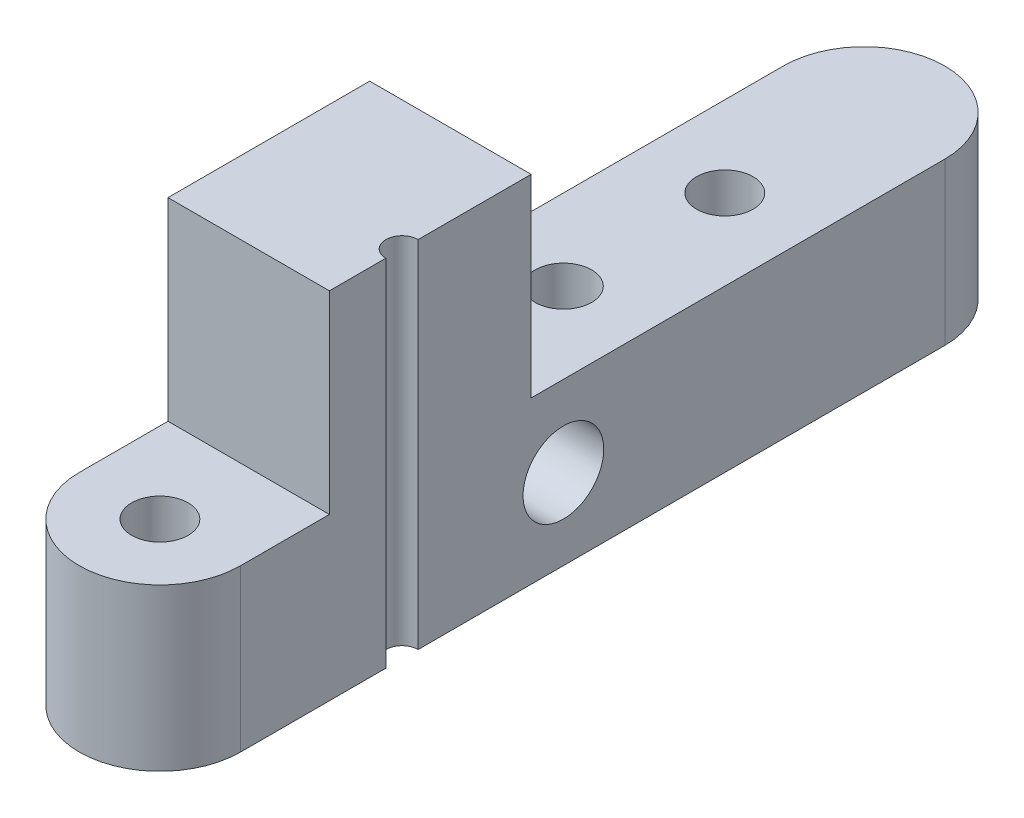
ISO-10303-21;
HEADER;
FILE_DESCRIPTION(('STEP AP214'),'2;1');
FILE_NAME('part.step','',(''),(''),'','','');
FILE_SCHEMA(('AUTOMOTIVE_DESIGN { 1 0 10303 214 1 1 1 1 }'));
ENDSEC;
DATA;
#1=APPLICATION_CONTEXT('core data for automotive mechanical design processes');
#2=APPLICATION_PROTOCOL_DEFINITION('international standard','automotive_design',2000,#1);
#3=PRODUCT_CONTEXT('',#1,'mechanical');
#4=PRODUCT('Part','Part','',(#3));
#5=PRODUCT_RELATED_PRODUCT_CATEGORY('part','',(#4));
#6=PRODUCT_DEFINITION_FORMATION('','',#4);
#7=PRODUCT_DEFINITION_CONTEXT('part definition',#1,'design');
#8=PRODUCT_DEFINITION('design','',#6,#7);
#9=PRODUCT_DEFINITION_SHAPE('','',#8);
#10=(LENGTH_UNIT() NAMED_UNIT(*) SI_UNIT(.MILLI.,.METRE.));
#11=(NAMED_UNIT(*) PLANE_ANGLE_UNIT() SI_UNIT($,.RADIAN.));
#12=(NAMED_UNIT(*) SI_UNIT($,.STERADIAN.) SOLID_ANGLE_UNIT());
#13=UNCERTAINTY_MEASURE_WITH_UNIT(LENGTH_MEASURE(1.E-05),#10,'distance_accuracy_value','');
#14=(GEOMETRIC_REPRESENTATION_CONTEXT(3) GLOBAL_UNCERTAINTY_ASSIGNED_CONTEXT((#13)) GLOBAL_UNIT_ASSIGNED_CONTEXT((#10,
#11,#12)) REPRESENTATION_CONTEXT('',''));
#15=CARTESIAN_POINT('',(0.,0.,0.));
#16=DIRECTION('',(0.,0.,1.));
#17=DIRECTION('',(1.,0.,0.));
#18=AXIS2_PLACEMENT_3D('',#15,#16,#17);
#19=CARTESIAN_POINT('',(0.,10.,-43.6303434416005));
#20=DIRECTION('',(0.,-1.,0.));
#21=DIRECTION('',(0.,0.,-1.));
#22=AXIS2_PLACEMENT_3D('',#19,#20,#21);
#23=CYLINDRICAL_SURFACE('',#22,5.);
#24=CARTESIAN_POINT('',(0.,0.,-43.6303434416005));
#25=DIRECTION('',(0.,1.,0.));
#26=DIRECTION('',(0.,0.,1.));
#27=AXIS2_PLACEMENT_3D('',#24,#25,#26);
#28=CIRCLE('',#27,5.);
#29=CARTESIAN_POINT('',(5.,0.,-43.6303434416005));
#30=VERTEX_POINT('',#29);
#31=CARTESIAN_POINT('',(-5.,0.,-43.6303434416005));
#32=VERTEX_POINT('',#31);
#33=EDGE_CURVE('E253',#30,#32,#28,.T.);
#34=ORIENTED_EDGE('',*,*,#33,.T.);
#35=DIRECTION('',(0.,-1.,0.));
#36=VECTOR('',#35,1.);
#37=CARTESIAN_POINT('',(-5.,10.,-43.6303434416005));
#38=LINE('',#37,#36);
#39=CARTESIAN_POINT('',(-5.,10.,-43.6303434416005));
#40=VERTEX_POINT('',#39);
#41=EDGE_CURVE('E261',#40,#32,#38,.T.);
#42=ORIENTED_EDGE('',*,*,#41,.F.);
#43=CARTESIAN_POINT('',(0.,10.,-43.6303434416005));
#44=DIRECTION('',(0.,1.,0.));
#45=DIRECTION('',(0.,0.,1.));
#46=AXIS2_PLACEMENT_3D('',#43,#44,#45);
#47=CIRCLE('',#46,5.);
#48=CARTESIAN_POINT('',(5.,10.,-43.6303434416005));
#49=VERTEX_POINT('',#48);
#50=EDGE_CURVE('E234',#49,#40,#47,.T.);
#51=ORIENTED_EDGE('',*,*,#50,.F.);
#52=DIRECTION('',(0.,-1.,0.));
#53=VECTOR('',#52,1.);
#54=CARTESIAN_POINT('',(5.,10.,-43.6303434416005));
#55=LINE('',#54,#53);
#56=EDGE_CURVE('E265',#49,#30,#55,.T.);
#57=ORIENTED_EDGE('',*,*,#56,.T.);
#58=EDGE_LOOP('',(#34,#42,#51,#57));
#59=FACE_BOUND('',#58,.T.);
#60=CARTESIAN_POINT('',(-2.,5.,-48.2129191365563));
#61=CARTESIAN_POINT('',(-1.99999540068022,5.10712368971296,-48.2129236693978));
#62=CARTESIAN_POINT('',(-1.99134173553407,5.21442629433185,-48.2167277795717));
#63=CARTESIAN_POINT('',(-1.95706710874823,5.42593908409957,-48.2314542746665));
#64=CARTESIAN_POINT('',(-1.93140279032341,5.53014065433852,-48.2423948478839));
#65=CARTESIAN_POINT('',(-1.86423554476216,5.73205180897083,-48.2699475487927));
#66=CARTESIAN_POINT('',(-1.82279228998551,5.82978424329122,-48.2865382842093));
#67=CARTESIAN_POINT('',(-1.72542013194152,6.0168853548623,-48.3234902134892));
#68=CARTESIAN_POINT('',(-1.66949439157707,6.10625585252411,-48.3438505838066));
#69=CARTESIAN_POINT('',(-1.54132201423254,6.27926031454434,-48.3873520572238));
#70=CARTESIAN_POINT('',(-1.46837936836551,6.36235639939725,-48.4105826118265));
#71=CARTESIAN_POINT('',(-1.30970909513215,6.5155290208558,-48.4564680207532));
#72=CARTESIAN_POINT('',(-1.22397701877347,6.58560100770971,-48.4791226715181));
#73=CARTESIAN_POINT('',(-1.03800631337303,6.71340639030971,-48.5223775180144));
#74=CARTESIAN_POINT('',(-0.937328966419092,6.77054429968594,-48.5428614777262));
#75=CARTESIAN_POINT('',(-0.726825322068637,6.86684357017379,-48.5783827186256));
#76=CARTESIAN_POINT('',(-0.617002769076881,6.90601224624887,-48.593422215633));
#77=CARTESIAN_POINT('',(-0.396966427039752,6.96334148599309,-48.6157266915066));
#78=CARTESIAN_POINT('',(-0.287028984858315,6.98242731397022,-48.6233328093068));
#79=CARTESIAN_POINT('',(-0.065266328583961,7.00202848578145,-48.6311465484748));
#80=CARTESIAN_POINT('',(0.0465581658394119,7.0025507559658,-48.631356929306));
#81=CARTESIAN_POINT('',(0.262232494702089,6.9855172301958,-48.6245630698066));
#82=CARTESIAN_POINT('',(0.366177452870457,6.96897522724529,-48.6179634093153));
#83=CARTESIAN_POINT('',(0.569673109221914,6.92000712369703,-48.5988363562919));
#84=CARTESIAN_POINT('',(0.669223484391239,6.88757985760154,-48.5863085288139));
#85=CARTESIAN_POINT('',(0.862897938510559,6.80736351712174,-48.5563116861751));
#86=CARTESIAN_POINT('',(0.956917623378897,6.75935028518462,-48.5387710462627));
#87=CARTESIAN_POINT('',(1.13580815074131,6.64953499308084,-48.5004892934032));
#88=CARTESIAN_POINT('',(1.22067584271796,6.58772820689983,-48.479747084272));
#89=CARTESIAN_POINT('',(1.38476882799018,6.44735086405612,-48.4355598133617));
#90=CARTESIAN_POINT('',(1.46325784526632,6.3679461074272,-48.4120267067181));
#91=CARTESIAN_POINT('',(1.60610741539265,6.197009428168,-48.3659600513331));
#92=CARTESIAN_POINT('',(1.67046334378698,6.1054735518044,-48.3434268316812));
#93=CARTESIAN_POINT('',(1.78490418871927,5.90958097762606,-48.3013124156907));
#94=CARTESIAN_POINT('',(1.83453465163626,5.80493516966135,-48.2818325821776));
#95=CARTESIAN_POINT('',(1.91517625986646,5.58778450968778,-48.2492193450413));
#96=CARTESIAN_POINT('',(1.94619949837798,5.47528481527341,-48.2360818205136));
#97=CARTESIAN_POINT('',(1.9869549488549,5.25296422253256,-48.2186410386276));
#98=CARTESIAN_POINT('',(1.99787209681454,5.14339955287144,-48.2138471061619));
#99=CARTESIAN_POINT('',(2.00156132644289,4.92392279224044,-48.2122384202909));
#100=CARTESIAN_POINT('',(1.99433891059128,4.81401081672435,-48.2154212472041));
#101=CARTESIAN_POINT('',(1.96303289479003,4.60354106504306,-48.2289038851916));
#102=CARTESIAN_POINT('',(1.93993306202386,4.50280706259994,-48.2387880195835));
#103=CARTESIAN_POINT('',(1.87880418691087,4.30671159521455,-48.2640439518739));
#104=CARTESIAN_POINT('',(1.84077183430228,4.21135132689285,-48.2794169664865));
#105=CARTESIAN_POINT('',(1.74913563948157,4.02439764220434,-48.3146812602015));
#106=CARTESIAN_POINT('',(1.69496286826465,3.93311381130547,-48.3347304879923));
#107=CARTESIAN_POINT('',(1.57316522444182,3.76051701255841,-48.3768472931784));
#108=CARTESIAN_POINT('',(1.50553487348189,3.67920812720455,-48.3989156905609));
#109=CARTESIAN_POINT('',(1.35284421168058,3.52262659140063,-48.4445526013146));
#110=CARTESIAN_POINT('',(1.26686542944543,3.4482434347084,-48.4681115144528));
#111=CARTESIAN_POINT('',(1.0830836333685,3.31482292339023,-48.5125413872758));
#112=CARTESIAN_POINT('',(0.985280138466607,3.25578619340488,-48.5334122375318));
#113=CARTESIAN_POINT('',(0.780279934003013,3.15495237353666,-48.5701806006044));
#114=CARTESIAN_POINT('',(0.673085480998742,3.11315115582634,-48.5860793040071));
#115=CARTESIAN_POINT('',(0.452393590914545,3.04845114760024,-48.6110705762895));
#116=CARTESIAN_POINT('',(0.338899610276817,3.02554209858931,-48.6201668386615));
#117=CARTESIAN_POINT('',(0.116816510362614,3.00049529834716,-48.6301335237191));
#118=CARTESIAN_POINT('',(0.00839049265208585,2.99709987143798,-48.6315019090979));
#119=CARTESIAN_POINT('',(-0.207433835792267,3.00785547938347,-48.6272038653377));
#120=CARTESIAN_POINT('',(-0.314832299614388,3.02200385815558,-48.6215385010882));
#121=CARTESIAN_POINT('',(-0.522170901733399,3.06654678799989,-48.6040585754188));
#122=CARTESIAN_POINT('',(-0.62223880386487,3.09642894475655,-48.5924382485904));
#123=CARTESIAN_POINT('',(-0.815922355542605,3.17105280588107,-48.5642929192741));
#124=CARTESIAN_POINT('',(-0.909536811189123,3.2157972509391,-48.5477670122291));
#125=CARTESIAN_POINT('',(-1.09220303880515,3.32110319335324,-48.5105243877192));
#126=CARTESIAN_POINT('',(-1.18087037518738,3.38227627532514,-48.4896547484725));
#127=CARTESIAN_POINT('',(-1.34705404014793,3.517788538747,-48.4462374638713));
#128=CARTESIAN_POINT('',(-1.42456572919735,3.59213316960822,-48.423689126243));
#129=CARTESIAN_POINT('',(-1.57120121894449,3.75731514684866,-48.3777211152773));
#130=CARTESIAN_POINT('',(-1.63950871002775,3.8488885751441,-48.3543339138814));
#131=CARTESIAN_POINT('',(-1.7598476276315,4.04294243572083,-48.310840010108));
#132=CARTESIAN_POINT('',(-1.81187714055767,4.14542414845355,-48.290733693555));
#133=CARTESIAN_POINT('',(-1.89399048451634,4.3490361864702,-48.2579325839911));
#134=CARTESIAN_POINT('',(-1.92562535665267,4.44946160271245,-48.2447344084046));
#135=CARTESIAN_POINT('',(-1.97271990928489,4.65448904149265,-48.2248017019417));
#136=CARTESIAN_POINT('',(-1.98822466191608,4.75907857342436,-48.2180491645048));
#137=CARTESIAN_POINT('',(-1.99692202185513,4.88677823911152,-48.2142610810214));
#138=CARTESIAN_POINT('',(-1.99807530751895,4.90940148035644,-48.2137587527733));
#139=CARTESIAN_POINT('',(-1.9996148112425,4.95468047679723,-48.2130872888277));
#140=CARTESIAN_POINT('',(-2.0000009730612,4.97733623425516,-48.2129181775597));
#141=CARTESIAN_POINT('',(-2.,5.,-48.2129191365563));
#142=B_SPLINE_CURVE_WITH_KNOTS('',3,(#60,#61,#62,#63,#64,#65,#66,#67,#68,#69,#70,#71,#72,#73,
#74,#75,#76,#77,#78,#79,#80,#81,#82,#83,#84,#85,#86,#87,#88,#89,#90,#91,#92,#93,#94,#95,#96,#97,
#98,#99,#100,#101,#102,#103,#104,#105,#106,#107,#108,#109,#110,#111,#112,#113,#114,#115,#116,
#117,#118,#119,#120,#121,#122,#123,#124,#125,#126,#127,#128,#129,#130,#131,#132,#133,#134,#135,
#136,#137,#138,#139,#140,#141),.UNSPECIFIED.,.T.,.F.,(4,2,2,2,2,2,2,2,2,2,2,2,2,2,2,2,2,2,2,2,2,
2,2,2,2,2,2,2,2,2,2,2,2,2,2,2,2,2,2,2,4),(0.,0.321277648767654,0.643377335822246,
0.964270823293392,1.28509428823861,1.62255618284425,1.96013574348342,2.31102669091428,
2.6617746696948,2.99554182887184,3.32918445305672,3.64408644830302,3.9590115512906,
4.27868300234898,4.59846414940031,4.93924044081356,5.28012807127127,5.63064458717257,
5.98093304800101,6.30982147524421,6.63861014907939,6.94867248085145,7.25880358651638,
7.58151154652701,7.90435114525849,8.25103734246979,8.59773764852748,8.94435487312812,
9.29078375954136,9.61461039755953,9.93838801512601,10.2522199444335,10.5661097782858,
10.8938705113992,11.2217671656421,11.5699625328561,11.9181988175919,12.2351666081908,
12.5512463021924,12.619212852096,12.6871843847255),.UNSPECIFIED.);
#143=CARTESIAN_POINT('',(-2.,5.,-48.2129191365563));
#144=VERTEX_POINT('',#143);
#145=EDGE_CURVE('E156',#144,#144,#142,.T.);
#146=ORIENTED_EDGE('',*,*,#145,.F.);
#147=EDGE_LOOP('',(#146));
#148=FACE_BOUND('',#147,.T.);
#149=ADVANCED_FACE('F42',(#59,#148),#23,.T.);
#150=CARTESIAN_POINT('',(0.,10.,-35.));
#151=DIRECTION('',(0.,-1.,0.));
#152=DIRECTION('',(0.,0.,-1.));
#153=AXIS2_PLACEMENT_3D('',#150,#151,#152);
#154=CYLINDRICAL_SURFACE('',#153,1.75);
#155=CARTESIAN_POINT('',(0.,10.,-35.));
#156=DIRECTION('',(0.,1.,0.));
#157=DIRECTION('',(0.,0.,1.));
#158=AXIS2_PLACEMENT_3D('',#155,#156,#157);
#159=CIRCLE('',#158,1.75);
#160=CARTESIAN_POINT('',(0.,10.,-33.25));
#161=VERTEX_POINT('',#160);
#162=EDGE_CURVE('E199',#161,#161,#159,.T.);
#163=ORIENTED_EDGE('',*,*,#162,.T.);
#164=EDGE_LOOP('',(#163));
#165=FACE_BOUND('',#164,.T.);
#166=CARTESIAN_POINT('',(0.,7.,-36.75));
#167=CARTESIAN_POINT('',(0.0818245025296046,6.99999318807239,-36.749993072029));
#168=CARTESIAN_POINT('',(0.16372359512841,6.9949308008218,-36.7442135533212));
#169=CARTESIAN_POINT('',(0.32479959879475,6.97512526523961,-36.7215252080675));
#170=CARTESIAN_POINT('',(0.4039723393443,6.96036792343921,-36.7046000641759));
#171=CARTESIAN_POINT('',(0.556827744458604,6.92252576757605,-36.6609405189438));
#172=CARTESIAN_POINT('',(0.630542392306208,6.89949502453024,-36.6342697911012));
#173=CARTESIAN_POINT('',(0.771699152967102,6.84666549739607,-36.5725539730338));
#174=CARTESIAN_POINT('',(0.839139739912402,6.81686507293721,-36.537506853007));
#175=CARTESIAN_POINT('',(0.991939149824093,6.73952576758103,-36.445442773154));
#176=CARTESIAN_POINT('',(1.07412381439225,6.68958652903394,-36.3851736631628));
#177=CARTESIAN_POINT('',(1.22495692232278,6.58367300323497,-36.2538087152204));
#178=CARTESIAN_POINT('',(1.293568816051,6.52768303188458,-36.18268453335));
#179=CARTESIAN_POINT('',(1.41872832285009,6.4122907089768,-36.029429712569));
#180=CARTESIAN_POINT('',(1.47498118660361,6.35284063182168,-35.9470933854036));
#181=CARTESIAN_POINT('',(1.54876159980759,6.26601395290817,-35.8162889297382));
#182=CARTESIAN_POINT('',(1.57157877870542,6.23747844904598,-35.771497892861));
#183=CARTESIAN_POINT('',(1.61360006507098,6.18215700992636,-35.6792383807082));
#184=CARTESIAN_POINT('',(1.63280691970974,6.1553697546056,-35.6317719772186));
#185=CARTESIAN_POINT('',(1.6679059757124,6.10412026346216,-35.5324002022851));
#186=CARTESIAN_POINT('',(1.6836826451294,6.07975083656859,-35.4804048106428));
#187=CARTESIAN_POINT('',(1.71066366224867,6.03647531840207,-35.3730664466866));
#188=CARTESIAN_POINT('',(1.7218768347095,6.01755870351363,-35.3177301752522));
#189=CARTESIAN_POINT('',(1.73769244890359,5.99027229931864,-35.2127989544757));
#190=CARTESIAN_POINT('',(1.74304826902134,5.98072504549264,-35.1636367133779));
#191=CARTESIAN_POINT('',(1.7495292330162,5.96912171143739,-35.0641843148816));
#192=CARTESIAN_POINT('',(1.75066103412104,5.9670538435471,-35.0138960580958));
#193=CARTESIAN_POINT('',(1.74859035454347,5.97079024682573,-34.9137180366401));
#194=CARTESIAN_POINT('',(1.74538759627129,5.97659502216709,-34.8638282976975));
#195=CARTESIAN_POINT('',(1.7349535991965,5.99500969173099,-34.7657324999082));
#196=CARTESIAN_POINT('',(1.72771432062414,6.00763316557452,-34.7175300059265));
#197=CARTESIAN_POINT('',(1.70425068598187,6.04704832941551,-34.5951140111742));
#198=CARTESIAN_POINT('',(1.68524057634185,6.07779336733177,-34.5227450969236));
#199=CARTESIAN_POINT('',(1.63956408638123,6.14609377879976,-34.3837860164874));
#200=CARTESIAN_POINT('',(1.61286560320825,6.18367745974127,-34.3172216378795));
#201=CARTESIAN_POINT('',(1.55839915810281,6.25418412125038,-34.2018061289853));
#202=CARTESIAN_POINT('',(1.53186466199221,6.28657835656164,-34.1520390320228));
#203=CARTESIAN_POINT('',(1.47437664589163,6.35207910768318,-34.0556124511574));
#204=CARTESIAN_POINT('',(1.44342064991219,6.38518601369889,-34.0089547300851));
#205=CARTESIAN_POINT('',(1.34400399882334,6.48403137058757,-33.8736426927592));
#206=CARTESIAN_POINT('',(1.26889002770649,6.54943862941952,-33.7894291167708));
#207=CARTESIAN_POINT('',(1.11988697529646,6.65903240259667,-33.6523630149891));
#208=CARTESIAN_POINT('',(1.04959566301807,6.70466429544594,-33.5967320757009));
#209=CARTESIAN_POINT('',(0.89840847088353,6.78894129539817,-33.4954715091943));
#210=CARTESIAN_POINT('',(0.81753125576864,6.82759842134043,-33.4498246481393));
#211=CARTESIAN_POINT('',(0.662316651015108,6.88862952123534,-33.3783670980447));
#212=CARTESIAN_POINT('',(0.589627656721596,6.91269981880513,-33.3504384193783));
#213=CARTESIAN_POINT('',(0.439113409856922,6.95274864621724,-33.3041629744114));
#214=CARTESIAN_POINT('',(0.361291215855797,6.96873194626232,-33.2858105592481));
#215=CARTESIAN_POINT('',(0.202082178271771,6.99139564503222,-33.2598283504202));
#216=CARTESIAN_POINT('',(0.120678598477803,6.99802618705894,-33.2522560201308));
#217=CARTESIAN_POINT('',(-0.0425790890073998,7.00121129889969,-33.2486154499501));
#218=CARTESIAN_POINT('',(-0.124433093705261,6.9977680838081,-33.2525446810081));
#219=CARTESIAN_POINT('',(-0.278782450467959,6.98186303926608,-33.2707522449664));
#220=CARTESIAN_POINT('',(-0.35147537495584,6.97020607795172,-33.2841071339384));
#221=CARTESIAN_POINT('',(-0.493146367127909,6.93960390658484,-33.3193337078847));
#222=CARTESIAN_POINT('',(-0.562123399277813,6.92065667675653,-33.3412077531199));
#223=CARTESIAN_POINT('',(-0.699573919513984,6.875149186195,-33.3941110973632));
#224=CARTESIAN_POINT('',(-0.767706525066316,6.84816520789075,-33.425654009535));
#225=CARTESIAN_POINT('',(-0.897526478387716,6.78872894045103,-33.4958724972625));
#226=CARTESIAN_POINT('',(-0.959213128004971,6.75627605997946,-33.534548844178));
#227=CARTESIAN_POINT('',(-1.10589019947564,6.66959013654285,-33.6393738761598));
#228=CARTESIAN_POINT('',(-1.18655293424206,6.61273845463906,-33.709422614471));
#229=CARTESIAN_POINT('',(-1.33282098201672,6.49414988479084,-33.8610186241862));
#230=CARTESIAN_POINT('',(-1.39834481262217,6.43238886050845,-33.9426244726878));
#231=CARTESIAN_POINT('',(-1.48580806586674,6.3394956296202,-34.0738728722587));
#232=CARTESIAN_POINT('',(-1.51340989881686,6.30812846907569,-34.1196733108013));
#233=CARTESIAN_POINT('',(-1.56460012429878,6.24644670063917,-34.2142371635083));
#234=CARTESIAN_POINT('',(-1.58818505491237,6.21613301840203,-34.263003084816));
#235=CARTESIAN_POINT('',(-1.63100683537039,6.15806234978259,-34.3633871859932));
#236=CARTESIAN_POINT('',(-1.6502716335038,6.13028966107165,-34.4149841753529));
#237=CARTESIAN_POINT('',(-1.6842667223411,6.07897582010599,-34.5215996411521));
#238=CARTESIAN_POINT('',(-1.69900685517872,6.05542553033133,-34.5766103738261));
#239=CARTESIAN_POINT('',(-1.72166632701625,6.01797844917071,-34.6824030075579));
#240=CARTESIAN_POINT('',(-1.73024695125749,6.00319713450213,-34.7327179626824));
#241=CARTESIAN_POINT('',(-1.74300419255664,5.98087102223166,-34.8353948087621));
#242=CARTESIAN_POINT('',(-1.74719463253129,5.97330351807746,-34.8877497333588));
#243=CARTESIAN_POINT('',(-1.75079218827415,5.96682232014371,-34.9935563506398));
#244=CARTESIAN_POINT('',(-1.75016635622607,5.96796823367362,-35.047013098418));
#245=CARTESIAN_POINT('',(-1.74412392212424,5.97880741416597,-35.1528256010528));
#246=CARTESIAN_POINT('',(-1.73869685714475,5.98851934820137,-35.2051786955602));
#247=CARTESIAN_POINT('',(-1.72104163156517,6.01902365002623,-35.3244530073888));
#248=CARTESIAN_POINT('',(-1.70715214718598,6.04242648250763,-35.3904304463704));
#249=CARTESIAN_POINT('',(-1.67299050807307,6.09641329870773,-35.517664163978));
#250=CARTESIAN_POINT('',(-1.65269569213523,6.12702267901647,-35.578902704136));
#251=CARTESIAN_POINT('',(-1.60958732771959,6.18761264630082,-35.6890034409965));
#252=CARTESIAN_POINT('',(-1.58748827260427,6.21711587742678,-35.7384179680774));
#253=CARTESIAN_POINT('',(-1.53925261579027,6.27757677636152,-35.8343157735127));
#254=CARTESIAN_POINT('',(-1.51311341343735,6.30853537199703,-35.8807971364476));
#255=CARTESIAN_POINT('',(-1.42869249299731,6.40209506707072,-36.0162095158258));
#256=CARTESIAN_POINT('',(-1.36442624927279,6.46535183419495,-36.1010617083196));
#257=CARTESIAN_POINT('',(-1.21728244333041,6.58993793433008,-36.2621552150292));
#258=CARTESIAN_POINT('',(-1.13382589353645,6.65111945404143,-36.3379846605815));
#259=CARTESIAN_POINT('',(-0.949576468877474,6.76347207155778,-36.4743871782486));
#260=CARTESIAN_POINT('',(-0.848849012594657,6.81467944043135,-36.5350157685951));
#261=CARTESIAN_POINT('',(-0.671312599684847,6.88544043118102,-36.6179178268691));
#262=CARTESIAN_POINT('',(-0.599133494248597,6.90973235953479,-36.6461206586022));
#263=CARTESIAN_POINT('',(-0.449671220554028,6.95032059710904,-36.6930422326007));
#264=CARTESIAN_POINT('',(-0.372399149150777,6.96663367759527,-36.7117808710074));
#265=CARTESIAN_POINT('',(-0.245453641042335,6.9854803116908,-36.7333916296852));
#266=CARTESIAN_POINT('',(-0.196745232404745,6.99090585643359,-36.7396005919032));
#267=CARTESIAN_POINT('',(-0.0987003687088782,6.99816820874578,-36.7479073862178));
#268=CARTESIAN_POINT('',(-0.0493637581310841,7.00000410955565,-36.7500041795633));
#269=CARTESIAN_POINT('',(0.,7.,-36.75));
#270=B_SPLINE_CURVE_WITH_KNOTS('',3,(#166,#167,#168,#169,#170,#171,#172,#173,#174,#175,#176,
#177,#178,#179,#180,#181,#182,#183,#184,#185,#186,#187,#188,#189,#190,#191,#192,#193,#194,#195,
#196,#197,#198,#199,#200,#201,#202,#203,#204,#205,#206,#207,#208,#209,#210,#211,#212,#213,#214,
#215,#216,#217,#218,#219,#220,#221,#222,#223,#224,#225,#226,#227,#228,#229,#230,#231,#232,#233,
#234,#235,#236,#237,#238,#239,#240,#241,#242,#243,#244,#245,#246,#247,#248,#249,#250,#251,#252,
#253,#254,#255,#256,#257,#258,#259,#260,#261,#262,#263,#264,#265,#266,#267,#268,#269),
.UNSPECIFIED.,.T.,.F.,(4,2,2,2,2,2,2,2,2,2,2,2,2,2,2,2,2,2,2,2,2,2,2,2,2,2,2,2,2,2,2,2,2,2,2,2,
2,2,2,2,2,2,2,2,2,2,2,2,2,2,2,4),(0.,0.245259053498181,0.490877970207243,0.734920001920514,
0.979021230978333,1.31764662075108,1.65717182784,2.00407930528858,2.17733919594492,
2.35046671106962,2.5287417301278,2.70667034903457,2.85712699179176,3.00734640831139,
3.15757544549674,3.30810477688744,3.54941436749755,3.79174653192186,3.98661943987438,
4.18160190541843,4.57072620124056,4.87145691596163,5.17166435980182,5.41519000548517,
5.65857183698305,5.90324622192581,6.14786681004676,6.37135328895926,6.59490172964729,
6.83337063587927,7.07186534360804,7.43299661757768,7.79602854590602,7.98185325625892,
8.16783731575105,8.35258105256036,8.5369200362573,8.69577149786123,8.85412128331189,
9.01355528783699,9.17333759176682,9.38624528122281,9.59991481619513,9.78461648492753,
9.96943754564029,10.3392519055546,10.7221756552521,11.1036797791213,11.3463920984025,
11.5885920284107,11.7365165636284,11.884478460396),.UNSPECIFIED.);
#271=CARTESIAN_POINT('',(0.,7.,-36.75));
#272=VERTEX_POINT('',#271);
#273=EDGE_CURVE('E46',#272,#272,#270,.T.);
#274=ORIENTED_EDGE('',*,*,#273,.T.);
#275=EDGE_LOOP('',(#274));
#276=FACE_BOUND('',#275,.T.);
#277=ADVANCED_FACE('F277',(#165,#276),#154,.F.);
#278=CARTESIAN_POINT('',(0.,0.,-35.));
#279=DIRECTION('',(0.,1.,0.));
#280=DIRECTION('',(0.,0.,1.));
#281=AXIS2_PLACEMENT_3D('',#278,#279,#280);
#282=CIRCLE('',#281,1.75);
#283=CARTESIAN_POINT('',(0.,0.,-33.25));
#284=VERTEX_POINT('',#283);
#285=EDGE_CURVE('E195',#284,#284,#282,.T.);
#286=ORIENTED_EDGE('',*,*,#285,.F.);
#287=EDGE_LOOP('',(#286));
#288=FACE_BOUND('',#287,.T.);
#289=CARTESIAN_POINT('',(0.,3.,-36.75));
#290=CARTESIAN_POINT('',(-0.0818245025296039,3.00000681192761,-36.749993072029));
#291=CARTESIAN_POINT('',(-0.163723595128409,3.00506919917821,-36.7442135533212));
#292=CARTESIAN_POINT('',(-0.324799598794748,3.02487473476039,-36.7215252080675));
#293=CARTESIAN_POINT('',(-0.403972339344298,3.03963207656079,-36.7046000641759));
#294=CARTESIAN_POINT('',(-0.556827744458603,3.07747423242395,-36.6609405189438));
#295=CARTESIAN_POINT('',(-0.630542392306208,3.10050497546976,-36.6342697911012));
#296=CARTESIAN_POINT('',(-0.771699152967101,3.15333450260393,-36.5725539730338));
#297=CARTESIAN_POINT('',(-0.8391397399124,3.18313492706279,-36.537506853007));
#298=CARTESIAN_POINT('',(-0.991939149824091,3.26047423241897,-36.445442773154));
#299=CARTESIAN_POINT('',(-1.07412381439225,3.31041347096606,-36.3851736631628));
#300=CARTESIAN_POINT('',(-1.22495692232278,3.41632699676503,-36.2538087152204));
#301=CARTESIAN_POINT('',(-1.293568816051,3.47231696811542,-36.18268453335));
#302=CARTESIAN_POINT('',(-1.41872832285009,3.5877092910232,-36.029429712569));
#303=CARTESIAN_POINT('',(-1.47498118660361,3.64715936817832,-35.9470933854036));
#304=CARTESIAN_POINT('',(-1.54876159980759,3.73398604709183,-35.8162889297382));
#305=CARTESIAN_POINT('',(-1.57157877870542,3.76252155095402,-35.771497892861));
#306=CARTESIAN_POINT('',(-1.61360006507098,3.81784299007364,-35.6792383807082));
#307=CARTESIAN_POINT('',(-1.63280691970974,3.8446302453944,-35.6317719772186));
#308=CARTESIAN_POINT('',(-1.6679059757124,3.89587973653784,-35.5324002022851));
#309=CARTESIAN_POINT('',(-1.68368264512939,3.92024916343141,-35.4804048106428));
#310=CARTESIAN_POINT('',(-1.71066366224867,3.96352468159794,-35.3730664466865));
#311=CARTESIAN_POINT('',(-1.7218768347095,3.98244129648637,-35.3177301752522));
#312=CARTESIAN_POINT('',(-1.73769244890359,4.00972770068136,-35.2127989544757));
#313=CARTESIAN_POINT('',(-1.74304826902134,4.01927495450736,-35.1636367133779));
#314=CARTESIAN_POINT('',(-1.7495292330162,4.03087828856261,-35.0641843148816));
#315=CARTESIAN_POINT('',(-1.75066103412104,4.0329461564529,-35.0138960580958));
#316=CARTESIAN_POINT('',(-1.74859035454347,4.02920975317427,-34.9137180366401));
#317=CARTESIAN_POINT('',(-1.74538759627128,4.02340497783291,-34.8638282976974));
#318=CARTESIAN_POINT('',(-1.7349535991965,4.00499030826901,-34.7657324999082));
#319=CARTESIAN_POINT('',(-1.72771432062414,3.99236683442548,-34.7175300059265));
#320=CARTESIAN_POINT('',(-1.70425068598186,3.95295167058448,-34.5951140111742));
#321=CARTESIAN_POINT('',(-1.68524057634184,3.92220663266822,-34.5227450969236));
#322=CARTESIAN_POINT('',(-1.63956408638122,3.85390622120024,-34.3837860164874));
#323=CARTESIAN_POINT('',(-1.61286560320824,3.81632254025872,-34.3172216378794));
#324=CARTESIAN_POINT('',(-1.5583991581028,3.74581587874961,-34.2018061289853));
#325=CARTESIAN_POINT('',(-1.5318646619922,3.71342164343835,-34.1520390320228));
#326=CARTESIAN_POINT('',(-1.47437664589162,3.64792089231681,-34.0556124511574));
#327=CARTESIAN_POINT('',(-1.44342064991218,3.61481398630109,-34.0089547300851));
#328=CARTESIAN_POINT('',(-1.34400399882332,3.51596862941242,-33.8736426927592));
#329=CARTESIAN_POINT('',(-1.26889002770647,3.45056137058046,-33.7894291167708));
#330=CARTESIAN_POINT('',(-1.11988697529644,3.34096759740332,-33.6523630149891));
#331=CARTESIAN_POINT('',(-1.04959566301805,3.29533570455405,-33.5967320757009));
#332=CARTESIAN_POINT('',(-0.898408470883515,3.21105870460183,-33.4954715091943));
#333=CARTESIAN_POINT('',(-0.817531255768626,3.17240157865957,-33.4498246481393));
#334=CARTESIAN_POINT('',(-0.662316651015092,3.11137047876466,-33.3783670980447));
#335=CARTESIAN_POINT('',(-0.589627656721577,3.08730018119487,-33.3504384193783));
#336=CARTESIAN_POINT('',(-0.439113409856903,3.04725135378276,-33.3041629744114));
#337=CARTESIAN_POINT('',(-0.36129121585578,3.03126805373768,-33.2858105592481));
#338=CARTESIAN_POINT('',(-0.202082178271754,3.00860435496778,-33.2598283504202));
#339=CARTESIAN_POINT('',(-0.120678598477785,3.00197381294106,-33.2522560201308));
#340=CARTESIAN_POINT('',(0.0425790890074187,2.99878870110031,-33.2486154499501));
#341=CARTESIAN_POINT('',(0.12443309370528,3.0022319161919,-33.2525446810081));
#342=CARTESIAN_POINT('',(0.278782450467978,3.01813696073392,-33.2707522449664));
#343=CARTESIAN_POINT('',(0.35147537495586,3.02979392204828,-33.2841071339384));
#344=CARTESIAN_POINT('',(0.493146367127928,3.06039609341517,-33.3193337078848));
#345=CARTESIAN_POINT('',(0.562123399277831,3.07934332324347,-33.34120775312));
#346=CARTESIAN_POINT('',(0.699573919514001,3.12485081380501,-33.3941110973632));
#347=CARTESIAN_POINT('',(0.767706525066334,3.15183479210926,-33.425654009535));
#348=CARTESIAN_POINT('',(0.897526478387733,3.21127105954898,-33.4958724972625));
#349=CARTESIAN_POINT('',(0.959213128004987,3.24372394002055,-33.534548844178));
#350=CARTESIAN_POINT('',(1.10589019947565,3.33040986345716,-33.6393738761598));
#351=CARTESIAN_POINT('',(1.18655293424208,3.38726154536096,-33.709422614471));
#352=CARTESIAN_POINT('',(1.33282098201674,3.50585011520918,-33.8610186241862));
#353=CARTESIAN_POINT('',(1.39834481262218,3.56761113949156,-33.9426244726878));
#354=CARTESIAN_POINT('',(1.48580806586674,3.66050437037981,-34.0738728722587));
#355=CARTESIAN_POINT('',(1.51340989881687,3.69187153092432,-34.1196733108013));
#356=CARTESIAN_POINT('',(1.56460012429879,3.75355329936084,-34.2142371635083));
#357=CARTESIAN_POINT('',(1.58818505491238,3.78386698159798,-34.263003084816));
#358=CARTESIAN_POINT('',(1.6310068353704,3.84193765021742,-34.3633871859932));
#359=CARTESIAN_POINT('',(1.6502716335038,3.86971033892836,-34.414984175353));
#360=CARTESIAN_POINT('',(1.6842667223411,3.92102417989402,-34.5215996411522));
#361=CARTESIAN_POINT('',(1.69900685517872,3.94457446966868,-34.5766103738261));
#362=CARTESIAN_POINT('',(1.72166632701625,3.9820215508293,-34.6824030075579));
#363=CARTESIAN_POINT('',(1.73024695125749,3.99680286549788,-34.7327179626824));
#364=CARTESIAN_POINT('',(1.74300419255664,4.01912897776835,-34.8353948087621));
#365=CARTESIAN_POINT('',(1.74719463253129,4.02669648192255,-34.8877497333588));
#366=CARTESIAN_POINT('',(1.75079218827415,4.03317767985629,-34.9935563506398));
#367=CARTESIAN_POINT('',(1.75016635622607,4.03203176632639,-35.047013098418));
#368=CARTESIAN_POINT('',(1.74412392212424,4.02119258583403,-35.1528256010528));
#369=CARTESIAN_POINT('',(1.73869685714475,4.01148065179863,-35.2051786955603));
#370=CARTESIAN_POINT('',(1.72104163156516,3.98097634997376,-35.3244530073888));
#371=CARTESIAN_POINT('',(1.70715214718598,3.95757351749236,-35.3904304463704));
#372=CARTESIAN_POINT('',(1.67299050807306,3.90358670129227,-35.5176641639781));
#373=CARTESIAN_POINT('',(1.65269569213522,3.87297732098352,-35.578902704136));
#374=CARTESIAN_POINT('',(1.60958732771958,3.81238735369918,-35.6890034409966));
#375=CARTESIAN_POINT('',(1.58748827260426,3.78288412257321,-35.7384179680774));
#376=CARTESIAN_POINT('',(1.53925261579026,3.72242322363847,-35.8343157735127));
#377=CARTESIAN_POINT('',(1.51311341343734,3.69146462800295,-35.8807971364476));
#378=CARTESIAN_POINT('',(1.42869249299729,3.59790493292927,-36.0162095158258));
#379=CARTESIAN_POINT('',(1.36442624927277,3.53464816580504,-36.1010617083196));
#380=CARTESIAN_POINT('',(1.21728244333039,3.41006206566991,-36.2621552150292));
#381=CARTESIAN_POINT('',(1.13382589353643,3.34888054595855,-36.3379846605815));
#382=CARTESIAN_POINT('',(0.949576468877446,3.23652792844221,-36.4743871782486));
#383=CARTESIAN_POINT('',(0.848849012594625,3.18532055956864,-36.5350157685951));
#384=CARTESIAN_POINT('',(0.671312599684811,3.11455956881897,-36.6179178268691));
#385=CARTESIAN_POINT('',(0.59913349424856,3.0902676404652,-36.6461206586022));
#386=CARTESIAN_POINT('',(0.449671220553992,3.04967940289095,-36.6930422326007));
#387=CARTESIAN_POINT('',(0.372399149150742,3.03336632240472,-36.7117808710074));
#388=CARTESIAN_POINT('',(0.245453641042305,3.0145196883092,-36.7333916296852));
#389=CARTESIAN_POINT('',(0.196745232404722,3.00909414356641,-36.7396005919032));
#390=CARTESIAN_POINT('',(0.0987003687088669,3.00183179125422,-36.7479073862178));
#391=CARTESIAN_POINT('',(0.0493637581310789,2.99999589044435,-36.7500041795633));
#392=CARTESIAN_POINT('',(0.,3.,-36.75));
#393=B_SPLINE_CURVE_WITH_KNOTS('',3,(#289,#290,#291,#292,#293,#294,#295,#296,#297,#298,#299,
#300,#301,#302,#303,#304,#305,#306,#307,#308,#309,#310,#311,#312,#313,#314,#315,#316,#317,#318,
#319,#320,#321,#322,#323,#324,#325,#326,#327,#328,#329,#330,#331,#332,#333,#334,#335,#336,#337,
#338,#339,#340,#341,#342,#343,#344,#345,#346,#347,#348,#349,#350,#351,#352,#353,#354,#355,#356,
#357,#358,#359,#360,#361,#362,#363,#364,#365,#366,#367,#368,#369,#370,#371,#372,#373,#374,#375,
#376,#377,#378,#379,#380,#381,#382,#383,#384,#385,#386,#387,#388,#389,#390,#391,#392),
.UNSPECIFIED.,.T.,.F.,(4,2,2,2,2,2,2,2,2,2,2,2,2,2,2,2,2,2,2,2,2,2,2,2,2,2,2,2,2,2,2,2,2,2,2,2,
2,2,2,2,2,2,2,2,2,2,2,2,2,2,2,4),(0.,0.245259053498181,0.490877970207242,0.734920001920511,
0.979021230978334,1.31764662075108,1.65717182784,2.00407930528858,2.17733919594492,
2.35046671106962,2.5287417301278,2.70667034903457,2.85712699179176,3.00734640831139,
3.15757544549674,3.30810477688744,3.54941436749757,3.79174653192188,3.98661943987441,
4.18160190541846,4.57072620124059,4.87145691596165,5.17166435980184,5.41519000548519,
5.65857183698307,5.90324622192582,6.14786681004678,6.37135328895928,6.59490172964731,
6.8333706358793,7.07186534360806,7.4329966175777,7.79602854590604,7.98185325625894,
8.16783731575106,8.35258105256037,8.53692003625732,8.69577149786125,8.85412128331191,
9.013555287837,9.17333759176684,9.38624528122284,9.59991481619515,9.78461648492755,
9.96943754564032,10.3392519055547,10.7221756552522,11.1036797791213,11.3463920984025,
11.5885920284107,11.7365165636284,11.884478460396),.UNSPECIFIED.);
#394=CARTESIAN_POINT('',(0.,3.,-36.75));
#395=VERTEX_POINT('',#394);
#396=EDGE_CURVE('E270',#395,#395,#393,.T.);
#397=ORIENTED_EDGE('',*,*,#396,.T.);
#398=EDGE_LOOP('',(#397));
#399=FACE_BOUND('',#398,.T.);
#400=ADVANCED_FACE('F315',(#288,#399),#154,.F.);
#401=CARTESIAN_POINT('',(0.,10.,0.));
#402=DIRECTION('',(0.,1.,0.));
#403=DIRECTION('',(0.,0.,1.));
#404=AXIS2_PLACEMENT_3D('',#401,#402,#403);
#405=PLANE('',#404);
#406=DIRECTION('',(1.,0.,0.));
#407=VECTOR('',#406,1.);
#408=CARTESIAN_POINT('',(5.,10.,-5.5));
#409=LINE('',#408,#407);
#410=CARTESIAN_POINT('',(-5.,10.,-5.5));
#411=VERTEX_POINT('',#410);
#412=CARTESIAN_POINT('',(5.,10.,-5.5));
#413=VERTEX_POINT('',#412);
#414=EDGE_CURVE('E65',#411,#413,#409,.T.);
#415=ORIENTED_EDGE('',*,*,#414,.F.);
#416=DIRECTION('',(0.,0.,1.));
#417=VECTOR('',#416,1.);
#418=CARTESIAN_POINT('',(-5.,10.,0.));
#419=LINE('',#418,#417);
#420=CARTESIAN_POINT('',(-5.,10.,0.));
#421=VERTEX_POINT('',#420);
#422=EDGE_CURVE('E237',#411,#421,#419,.T.);
#423=ORIENTED_EDGE('',*,*,#422,.T.);
#424=CARTESIAN_POINT('',(0.,10.,0.));
#425=DIRECTION('',(0.,1.,0.));
#426=DIRECTION('',(0.,0.,1.));
#427=AXIS2_PLACEMENT_3D('',#424,#425,#426);
#428=CIRCLE('',#427,5.);
#429=CARTESIAN_POINT('',(5.,10.,0.));
#430=VERTEX_POINT('',#429);
#431=EDGE_CURVE('E223',#421,#430,#428,.T.);
#432=ORIENTED_EDGE('',*,*,#431,.T.);
#433=DIRECTION('',(0.,0.,-1.));
#434=VECTOR('',#433,1.);
#435=CARTESIAN_POINT('',(5.,10.,0.));
#436=LINE('',#435,#434);
#437=EDGE_CURVE('E227',#430,#413,#436,.T.);
#438=ORIENTED_EDGE('',*,*,#437,.T.);
#439=EDGE_LOOP('',(#415,#423,#432,#438));
#440=FACE_BOUND('',#439,.T.);
#441=CARTESIAN_POINT('',(0.,10.,0.));
#442=DIRECTION('',(0.,1.,0.));
#443=DIRECTION('',(0.,0.,1.));
#444=AXIS2_PLACEMENT_3D('',#441,#442,#443);
#445=CIRCLE('',#444,1.75);
#446=CARTESIAN_POINT('',(0.,10.,1.75));
#447=VERTEX_POINT('',#446);
#448=EDGE_CURVE('E215',#447,#447,#445,.T.);
#449=ORIENTED_EDGE('',*,*,#448,.F.);
#450=EDGE_LOOP('',(#449));
#451=FACE_BOUND('',#450,.T.);
#452=ADVANCED_FACE('F347',(#440,#451),#405,.T.);
#453=DIRECTION('',(-1.,0.,0.));
#454=VECTOR('',#453,1.);
#455=CARTESIAN_POINT('',(5.,10.,-18.));
#456=LINE('',#455,#454);
#457=CARTESIAN_POINT('',(5.,10.,-18.));
#458=VERTEX_POINT('',#457);
#459=CARTESIAN_POINT('',(-5.,10.,-18.));
#460=VERTEX_POINT('',#459);
#461=EDGE_CURVE('E73',#458,#460,#456,.T.);
#462=ORIENTED_EDGE('',*,*,#461,.F.);
#463=DIRECTION('',(0.,0.,-1.));
#464=VECTOR('',#463,1.);
#465=CARTESIAN_POINT('',(5.,10.,-11.));
#466=LINE('',#465,#464);
#467=EDGE_CURVE('E231',#458,#49,#466,.T.);
#468=ORIENTED_EDGE('',*,*,#467,.T.);
#469=ORIENTED_EDGE('',*,*,#50,.T.);
#470=EDGE_CURVE('E238',#40,#460,#419,.T.);
#471=ORIENTED_EDGE('',*,*,#470,.T.);
#472=EDGE_LOOP('',(#462,#468,#469,#471));
#473=FACE_BOUND('',#472,.T.);
#474=CARTESIAN_POINT('',(0.,10.,-25.));
#475=DIRECTION('',(0.,1.,0.));
#476=DIRECTION('',(0.,0.,1.));
#477=AXIS2_PLACEMENT_3D('',#474,#475,#476);
#478=CIRCLE('',#477,1.75);
#479=CARTESIAN_POINT('',(0.,10.,-23.25));
#480=VERTEX_POINT('',#479);
#481=EDGE_CURVE('E207',#480,#480,#478,.T.);
#482=ORIENTED_EDGE('',*,*,#481,.F.);
#483=EDGE_LOOP('',(#482));
#484=FACE_BOUND('',#483,.T.);
#485=ORIENTED_EDGE('',*,*,#162,.F.);
#486=EDGE_LOOP('',(#485));
#487=FACE_BOUND('',#486,.T.);
#488=ADVANCED_FACE('F337',(#473,#484,#487),#405,.T.);
#489=CARTESIAN_POINT('',(0.,0.,0.));
#490=DIRECTION('',(0.,1.,0.));
#491=DIRECTION('',(0.,0.,1.));
#492=AXIS2_PLACEMENT_3D('',#489,#490,#491);
#493=PLANE('',#492);
#494=CARTESIAN_POINT('',(0.,0.,0.));
#495=DIRECTION('',(0.,1.,0.));
#496=DIRECTION('',(0.,0.,1.));
#497=AXIS2_PLACEMENT_3D('',#494,#495,#496);
#498=CIRCLE('',#497,5.);
#499=CARTESIAN_POINT('',(-5.,0.,0.));
#500=VERTEX_POINT('',#499);
#501=CARTESIAN_POINT('',(5.,0.,0.));
#502=VERTEX_POINT('',#501);
#503=EDGE_CURVE('E219',#500,#502,#498,.T.);
#504=ORIENTED_EDGE('',*,*,#503,.F.);
#505=DIRECTION('',(0.,0.,1.));
#506=VECTOR('',#505,1.);
#507=CARTESIAN_POINT('',(-5.,0.,0.));
#508=LINE('',#507,#506);
#509=EDGE_CURVE('E228',#32,#500,#508,.T.);
#510=ORIENTED_EDGE('',*,*,#509,.F.);
#511=ORIENTED_EDGE('',*,*,#33,.F.);
#512=DIRECTION('',(0.,0.,-1.));
#513=VECTOR('',#512,1.);
#514=CARTESIAN_POINT('',(5.,0.,-11.));
#515=LINE('',#514,#513);
#516=CARTESIAN_POINT('',(5.,0.,-11.));
#517=VERTEX_POINT('',#516);
#518=EDGE_CURVE('E250',#517,#30,#515,.T.);
#519=ORIENTED_EDGE('',*,*,#518,.F.);
#520=CARTESIAN_POINT('',(5.,0.,-10.));
#521=DIRECTION('',(0.,-1.,0.));
#522=DIRECTION('',(0.,0.,1.));
#523=AXIS2_PLACEMENT_3D('',#520,#521,#522);
#524=CIRCLE('',#523,0.999999999999997);
#525=CARTESIAN_POINT('',(5.,0.,-9.));
#526=VERTEX_POINT('',#525);
#527=EDGE_CURVE('E247',#526,#517,#524,.T.);
#528=ORIENTED_EDGE('',*,*,#527,.F.);
#529=DIRECTION('',(0.,0.,-1.));
#530=VECTOR('',#529,1.);
#531=CARTESIAN_POINT('',(5.,0.,0.));
#532=LINE('',#531,#530);
#533=EDGE_CURVE('E132',#502,#526,#532,.T.);
#534=ORIENTED_EDGE('',*,*,#533,.F.);
#535=EDGE_LOOP('',(#504,#510,#511,#519,#528,#534));
#536=FACE_BOUND('',#535,.T.);
#537=CARTESIAN_POINT('',(0.,0.,0.));
#538=DIRECTION('',(0.,1.,0.));
#539=DIRECTION('',(0.,0.,1.));
#540=AXIS2_PLACEMENT_3D('',#537,#538,#539);
#541=CIRCLE('',#540,1.75);
#542=CARTESIAN_POINT('',(0.,0.,1.75));
#543=VERTEX_POINT('',#542);
#544=EDGE_CURVE('E211',#543,#543,#541,.T.);
#545=ORIENTED_EDGE('',*,*,#544,.T.);
#546=EDGE_LOOP('',(#545));
#547=FACE_BOUND('',#546,.T.);
#548=CARTESIAN_POINT('',(0.,0.,-25.));
#549=DIRECTION('',(0.,1.,0.));
#550=DIRECTION('',(0.,0.,1.));
#551=AXIS2_PLACEMENT_3D('',#548,#549,#550);
#552=CIRCLE('',#551,1.75);
#553=CARTESIAN_POINT('',(0.,0.,-23.25));
#554=VERTEX_POINT('',#553);
#555=EDGE_CURVE('E203',#554,#554,#552,.T.);
#556=ORIENTED_EDGE('',*,*,#555,.T.);
#557=EDGE_LOOP('',(#556));
#558=FACE_BOUND('',#557,.T.);
#559=ORIENTED_EDGE('',*,*,#285,.T.);
#560=EDGE_LOOP('',(#559));
#561=FACE_BOUND('',#560,.T.);
#562=ADVANCED_FACE('F332',(#536,#547,#558,#561),#493,.F.);
#563=CARTESIAN_POINT('',(0.,10.,0.));
#564=DIRECTION('',(0.,-1.,0.));
#565=DIRECTION('',(0.,0.,-1.));
#566=AXIS2_PLACEMENT_3D('',#563,#564,#565);
#567=CYLINDRICAL_SURFACE('',#566,5.);
#568=ORIENTED_EDGE('',*,*,#503,.T.);
#569=DIRECTION('',(0.,-1.,0.));
#570=VECTOR('',#569,1.);
#571=CARTESIAN_POINT('',(5.,10.,0.));
#572=LINE('',#571,#570);
#573=EDGE_CURVE('E11',#430,#502,#572,.T.);
#574=ORIENTED_EDGE('',*,*,#573,.F.);
#575=ORIENTED_EDGE('',*,*,#431,.F.);
#576=DIRECTION('',(0.,-1.,0.));
#577=VECTOR('',#576,1.);
#578=CARTESIAN_POINT('',(-5.,10.,0.));
#579=LINE('',#578,#577);
#580=EDGE_CURVE('E241',#421,#500,#579,.T.);
#581=ORIENTED_EDGE('',*,*,#580,.T.);
#582=EDGE_LOOP('',(#568,#574,#575,#581));
#583=FACE_BOUND('',#582,.T.);
#584=ADVANCED_FACE('F44',(#583),#567,.T.);
#585=CARTESIAN_POINT('',(5.,10.,0.));
#586=DIRECTION('',(-1.,0.,0.));
#587=DIRECTION('',(0.,0.,1.));
#588=AXIS2_PLACEMENT_3D('',#585,#586,#587);
#589=PLANE('',#588);
#590=ORIENTED_EDGE('',*,*,#533,.T.);
#591=DIRECTION('',(0.,-1.,0.));
#592=VECTOR('',#591,1.);
#593=CARTESIAN_POINT('',(5.,10.,-9.));
#594=LINE('',#593,#592);
#595=CARTESIAN_POINT('',(5.,22.,-9.));
#596=VERTEX_POINT('',#595);
#597=EDGE_CURVE('E57',#596,#526,#594,.T.);
#598=ORIENTED_EDGE('',*,*,#597,.F.);
#599=DIRECTION('',(0.,0.,-1.));
#600=VECTOR('',#599,1.);
#601=CARTESIAN_POINT('',(5.,22.,-5.5));
#602=LINE('',#601,#600);
#603=CARTESIAN_POINT('',(5.,22.,-5.5));
#604=VERTEX_POINT('',#603);
#605=EDGE_CURVE('E131',#604,#596,#602,.T.);
#606=ORIENTED_EDGE('',*,*,#605,.F.);
#607=DIRECTION('',(0.,-1.,0.));
#608=VECTOR('',#607,1.);
#609=CARTESIAN_POINT('',(5.,22.,-5.5));
#610=LINE('',#609,#608);
#611=EDGE_CURVE('E173',#604,#413,#610,.T.);
#612=ORIENTED_EDGE('',*,*,#611,.T.);
#613=ORIENTED_EDGE('',*,*,#437,.F.);
#614=ORIENTED_EDGE('',*,*,#573,.T.);
#615=EDGE_LOOP('',(#590,#598,#606,#612,#613,#614));
#616=FACE_BOUND('',#615,.T.);
#617=ADVANCED_FACE('F128',(#616),#589,.F.);
#618=CARTESIAN_POINT('',(5.,10.,-10.));
#619=DIRECTION('',(0.,-1.,0.));
#620=DIRECTION('',(0.,0.,-1.));
#621=AXIS2_PLACEMENT_3D('',#618,#619,#620);
#622=CYLINDRICAL_SURFACE('',#621,0.999999999999997);
#623=ORIENTED_EDGE('',*,*,#527,.T.);
#624=DIRECTION('',(0.,-1.,0.));
#625=VECTOR('',#624,1.);
#626=CARTESIAN_POINT('',(5.,10.,-11.));
#627=LINE('',#626,#625);
#628=CARTESIAN_POINT('',(5.,22.,-11.));
#629=VERTEX_POINT('',#628);
#630=EDGE_CURVE('E136',#629,#517,#627,.T.);
#631=ORIENTED_EDGE('',*,*,#630,.F.);
#632=CARTESIAN_POINT('',(5.,22.,-10.));
#633=DIRECTION('',(0.,-1.,0.));
#634=DIRECTION('',(0.,0.,1.));
#635=AXIS2_PLACEMENT_3D('',#632,#633,#634);
#636=CIRCLE('',#635,0.999999999999997);
#637=EDGE_CURVE('E139',#596,#629,#636,.T.);
#638=ORIENTED_EDGE('',*,*,#637,.F.);
#639=ORIENTED_EDGE('',*,*,#597,.T.);
#640=EDGE_LOOP('',(#623,#631,#638,#639));
#641=FACE_BOUND('',#640,.T.);
#642=ADVANCED_FACE('F140',(#641),#622,.F.);
#643=CARTESIAN_POINT('',(5.,10.,-11.));
#644=DIRECTION('',(-1.,0.,0.));
#645=DIRECTION('',(0.,0.,1.));
#646=AXIS2_PLACEMENT_3D('',#643,#644,#645);
#647=PLANE('',#646);
#648=CARTESIAN_POINT('',(5.,5.,-20.));
#649=DIRECTION('',(1.,0.,0.));
#650=DIRECTION('',(0.,0.,-1.));
#651=AXIS2_PLACEMENT_3D('',#648,#649,#650);
#652=CIRCLE('',#651,2.5);
#653=CARTESIAN_POINT('',(5.,5.,-22.5));
#654=VERTEX_POINT('',#653);
#655=EDGE_CURVE('E190',#654,#654,#652,.T.);
#656=ORIENTED_EDGE('',*,*,#655,.F.);
#657=EDGE_LOOP('',(#656));
#658=FACE_BOUND('',#657,.T.);
#659=ORIENTED_EDGE('',*,*,#518,.T.);
#660=ORIENTED_EDGE('',*,*,#56,.F.);
#661=ORIENTED_EDGE('',*,*,#467,.F.);
#662=DIRECTION('',(0.,-1.,0.));
#663=VECTOR('',#662,1.);
#664=CARTESIAN_POINT('',(5.,22.,-18.));
#665=LINE('',#664,#663);
#666=CARTESIAN_POINT('',(5.,22.,-18.));
#667=VERTEX_POINT('',#666);
#668=EDGE_CURVE('E186',#667,#458,#665,.T.);
#669=ORIENTED_EDGE('',*,*,#668,.F.);
#670=DIRECTION('',(0.,0.,-1.));
#671=VECTOR('',#670,1.);
#672=CARTESIAN_POINT('',(5.,22.,-11.));
#673=LINE('',#672,#671);
#674=EDGE_CURVE('E145',#629,#667,#673,.T.);
#675=ORIENTED_EDGE('',*,*,#674,.F.);
#676=ORIENTED_EDGE('',*,*,#630,.T.);
#677=EDGE_LOOP('',(#659,#660,#661,#669,#675,#676));
#678=FACE_BOUND('',#677,.T.);
#679=ADVANCED_FACE('F323',(#658,#678),#647,.F.);
#680=CARTESIAN_POINT('',(-5.,10.,0.));
#681=DIRECTION('',(1.,0.,0.));
#682=DIRECTION('',(0.,0.,-1.));
#683=AXIS2_PLACEMENT_3D('',#680,#681,#682);
#684=PLANE('',#683);
#685=CARTESIAN_POINT('',(-5.,5.,-20.));
#686=DIRECTION('',(1.,0.,0.));
#687=DIRECTION('',(0.,0.,-1.));
#688=AXIS2_PLACEMENT_3D('',#685,#686,#687);
#689=CIRCLE('',#688,2.5);
#690=CARTESIAN_POINT('',(-5.,5.,-22.5));
#691=VERTEX_POINT('',#690);
#692=EDGE_CURVE('E191',#691,#691,#689,.T.);
#693=ORIENTED_EDGE('',*,*,#692,.T.);
#694=EDGE_LOOP('',(#693));
#695=FACE_BOUND('',#694,.T.);
#696=ORIENTED_EDGE('',*,*,#509,.T.);
#697=ORIENTED_EDGE('',*,*,#580,.F.);
#698=ORIENTED_EDGE('',*,*,#422,.F.);
#699=DIRECTION('',(0.,-1.,0.));
#700=VECTOR('',#699,1.);
#701=CARTESIAN_POINT('',(-5.,22.,-5.5));
#702=LINE('',#701,#700);
#703=CARTESIAN_POINT('',(-5.,22.,-5.5));
#704=VERTEX_POINT('',#703);
#705=EDGE_CURVE('E178',#704,#411,#702,.T.);
#706=ORIENTED_EDGE('',*,*,#705,.F.);
#707=DIRECTION('',(0.,0.,1.));
#708=VECTOR('',#707,1.);
#709=CARTESIAN_POINT('',(-5.,22.,-5.5));
#710=LINE('',#709,#708);
#711=CARTESIAN_POINT('',(-5.,22.,-18.));
#712=VERTEX_POINT('',#711);
#713=EDGE_CURVE('E168',#712,#704,#710,.T.);
#714=ORIENTED_EDGE('',*,*,#713,.F.);
#715=DIRECTION('',(0.,-1.,0.));
#716=VECTOR('',#715,1.);
#717=CARTESIAN_POINT('',(-5.,22.,-18.));
#718=LINE('',#717,#716);
#719=EDGE_CURVE('E182',#712,#460,#718,.T.);
#720=ORIENTED_EDGE('',*,*,#719,.T.);
#721=ORIENTED_EDGE('',*,*,#470,.F.);
#722=ORIENTED_EDGE('',*,*,#41,.T.);
#723=EDGE_LOOP('',(#696,#697,#698,#706,#714,#720,#721,#722));
#724=FACE_BOUND('',#723,.T.);
#725=ADVANCED_FACE('F321',(#695,#724),#684,.F.);
#726=CARTESIAN_POINT('',(0.,10.,0.));
#727=DIRECTION('',(0.,-1.,0.));
#728=DIRECTION('',(0.,0.,-1.));
#729=AXIS2_PLACEMENT_3D('',#726,#727,#728);
#730=CYLINDRICAL_SURFACE('',#729,1.75);
#731=ORIENTED_EDGE('',*,*,#448,.T.);
#732=EDGE_LOOP('',(#731));
#733=FACE_BOUND('',#732,.T.);
#734=ORIENTED_EDGE('',*,*,#544,.F.);
#735=EDGE_LOOP('',(#734));
#736=FACE_BOUND('',#735,.T.);
#737=ADVANCED_FACE('F306',(#733,#736),#730,.F.);
#738=CARTESIAN_POINT('',(0.,10.,-25.));
#739=DIRECTION('',(0.,-1.,0.));
#740=DIRECTION('',(0.,0.,-1.));
#741=AXIS2_PLACEMENT_3D('',#738,#739,#740);
#742=CYLINDRICAL_SURFACE('',#741,1.75);
#743=ORIENTED_EDGE('',*,*,#481,.T.);
#744=EDGE_LOOP('',(#743));
#745=FACE_BOUND('',#744,.T.);
#746=ORIENTED_EDGE('',*,*,#555,.F.);
#747=EDGE_LOOP('',(#746));
#748=FACE_BOUND('',#747,.T.);
#749=ADVANCED_FACE('F301',(#745,#748),#742,.F.);
#750=CARTESIAN_POINT('',(-5.,5.,-20.));
#751=DIRECTION('',(1.,0.,0.));
#752=DIRECTION('',(0.,0.,-1.));
#753=AXIS2_PLACEMENT_3D('',#750,#751,#752);
#754=CYLINDRICAL_SURFACE('',#753,2.5);
#755=ORIENTED_EDGE('',*,*,#692,.F.);
#756=EDGE_LOOP('',(#755));
#757=FACE_BOUND('',#756,.T.);
#758=ORIENTED_EDGE('',*,*,#655,.T.);
#759=EDGE_LOOP('',(#758));
#760=FACE_BOUND('',#759,.T.);
#761=ADVANCED_FACE('F298',(#757,#760),#754,.F.);
#762=CARTESIAN_POINT('',(5.,22.,-18.));
#763=DIRECTION('',(0.,0.,1.));
#764=DIRECTION('',(1.,0.,0.));
#765=AXIS2_PLACEMENT_3D('',#762,#763,#764);
#766=PLANE('',#765);
#767=ORIENTED_EDGE('',*,*,#461,.T.);
#768=ORIENTED_EDGE('',*,*,#719,.F.);
#769=DIRECTION('',(-1.,0.,0.));
#770=VECTOR('',#769,1.);
#771=CARTESIAN_POINT('',(5.,22.,-18.));
#772=LINE('',#771,#770);
#773=EDGE_CURVE('E165',#667,#712,#772,.T.);
#774=ORIENTED_EDGE('',*,*,#773,.F.);
#775=ORIENTED_EDGE('',*,*,#668,.T.);
#776=EDGE_LOOP('',(#767,#768,#774,#775));
#777=FACE_BOUND('',#776,.T.);
#778=ADVANCED_FACE('F295',(#777),#766,.F.);
#779=CARTESIAN_POINT('',(5.,22.,-5.5));
#780=DIRECTION('',(0.,0.,-1.));
#781=DIRECTION('',(-1.,0.,0.));
#782=AXIS2_PLACEMENT_3D('',#779,#780,#781);
#783=PLANE('',#782);
#784=ORIENTED_EDGE('',*,*,#414,.T.);
#785=ORIENTED_EDGE('',*,*,#611,.F.);
#786=DIRECTION('',(1.,0.,0.));
#787=VECTOR('',#786,1.);
#788=CARTESIAN_POINT('',(5.,22.,-5.5));
#789=LINE('',#788,#787);
#790=EDGE_CURVE('E149',#704,#604,#789,.T.);
#791=ORIENTED_EDGE('',*,*,#790,.F.);
#792=ORIENTED_EDGE('',*,*,#705,.T.);
#793=EDGE_LOOP('',(#784,#785,#791,#792));
#794=FACE_BOUND('',#793,.T.);
#795=ADVANCED_FACE('F292',(#794),#783,.F.);
#796=CARTESIAN_POINT('',(5.,22.,-10.));
#797=DIRECTION('',(0.,1.,0.));
#798=DIRECTION('',(0.,0.,1.));
#799=AXIS2_PLACEMENT_3D('',#796,#797,#798);
#800=PLANE('',#799);
#801=ORIENTED_EDGE('',*,*,#605,.T.);
#802=ORIENTED_EDGE('',*,*,#637,.T.);
#803=ORIENTED_EDGE('',*,*,#674,.T.);
#804=ORIENTED_EDGE('',*,*,#773,.T.);
#805=ORIENTED_EDGE('',*,*,#713,.T.);
#806=ORIENTED_EDGE('',*,*,#790,.T.);
#807=EDGE_LOOP('',(#801,#802,#803,#804,#805,#806));
#808=FACE_BOUND('',#807,.T.);
#809=ADVANCED_FACE('F147',(#808),#800,.T.);
#810=CARTESIAN_POINT('',(0.,5.,-30.));
#811=DIRECTION('',(0.,0.,-1.));
#812=DIRECTION('',(-1.,0.,0.));
#813=AXIS2_PLACEMENT_3D('',#810,#811,#812);
#814=CYLINDRICAL_SURFACE('',#813,2.);
#815=CARTESIAN_POINT('',(0.,5.,-30.));
#816=DIRECTION('',(0.,0.,1.));
#817=DIRECTION('',(1.,0.,0.));
#818=AXIS2_PLACEMENT_3D('',#815,#816,#817);
#819=CIRCLE('',#818,2.);
#820=CARTESIAN_POINT('',(2.,5.,-30.));
#821=VERTEX_POINT('',#820);
#822=EDGE_CURVE('E276',#821,#821,#819,.T.);
#823=ORIENTED_EDGE('',*,*,#822,.T.);
#824=EDGE_LOOP('',(#823));
#825=FACE_BOUND('',#824,.T.);
#826=ORIENTED_EDGE('',*,*,#396,.F.);
#827=EDGE_LOOP('',(#826));
#828=FACE_BOUND('',#827,.T.);
#829=ORIENTED_EDGE('',*,*,#273,.F.);
#830=EDGE_LOOP('',(#829));
#831=FACE_BOUND('',#830,.T.);
#832=ORIENTED_EDGE('',*,*,#145,.T.);
#833=EDGE_LOOP('',(#832));
#834=FACE_BOUND('',#833,.T.);
#835=ADVANCED_FACE('F281',(#825,#828,#831,#834),#814,.F.);
#836=CARTESIAN_POINT('',(0.,5.,-30.));
#837=DIRECTION('',(0.,0.,1.));
#838=DIRECTION('',(1.,0.,0.));
#839=AXIS2_PLACEMENT_3D('',#836,#837,#838);
#840=PLANE('',#839);
#841=ORIENTED_EDGE('',*,*,#822,.F.);
#842=EDGE_LOOP('',(#841));
#843=FACE_BOUND('',#842,.T.);
#844=ADVANCED_FACE('F286',(#843),#840,.F.);
#845=CLOSED_SHELL('',(#149,#277,#400,#452,#488,#562,#584,#617,#642,#679,#725,#737,#749,#761,
#778,#795,#809,#835,#844));
#846=MANIFOLD_SOLID_BREP('B2',#845);
#847=ADVANCED_BREP_SHAPE_REPRESENTATION('',(#18,#846),#14);
#848=SHAPE_DEFINITION_REPRESENTATION(#9,#847);
ENDSEC;
END-ISO-10303-21;
